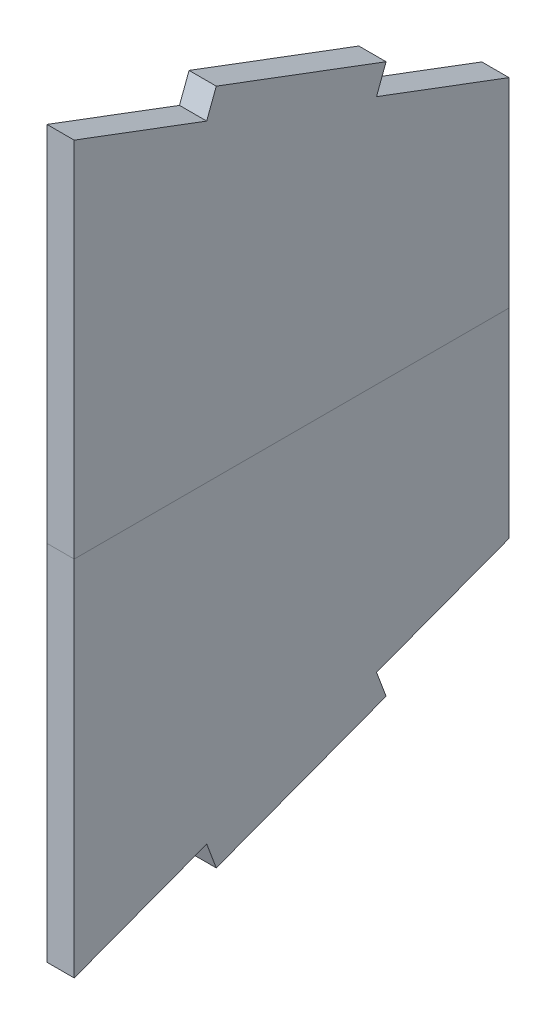
ISO-10303-21;
HEADER;
FILE_DESCRIPTION(('STEP AP214'),'2;1');
FILE_NAME('part.step','',(''),(''),'','','');
FILE_SCHEMA(('AUTOMOTIVE_DESIGN { 1 0 10303 214 1 1 1 1 }'));
ENDSEC;
DATA;
#1=APPLICATION_CONTEXT('core data for automotive mechanical design processes');
#2=APPLICATION_PROTOCOL_DEFINITION('international standard','automotive_design',2000,#1);
#3=PRODUCT_CONTEXT('',#1,'mechanical');
#4=PRODUCT('Part','Part','',(#3));
#5=PRODUCT_RELATED_PRODUCT_CATEGORY('part','',(#4));
#6=PRODUCT_DEFINITION_FORMATION('','',#4);
#7=PRODUCT_DEFINITION_CONTEXT('part definition',#1,'design');
#8=PRODUCT_DEFINITION('design','',#6,#7);
#9=PRODUCT_DEFINITION_SHAPE('','',#8);
#10=(LENGTH_UNIT() NAMED_UNIT(*) SI_UNIT(.MILLI.,.METRE.));
#11=(NAMED_UNIT(*) PLANE_ANGLE_UNIT() SI_UNIT($,.RADIAN.));
#12=(NAMED_UNIT(*) SI_UNIT($,.STERADIAN.) SOLID_ANGLE_UNIT());
#13=UNCERTAINTY_MEASURE_WITH_UNIT(LENGTH_MEASURE(1.E-05),#10,'distance_accuracy_value','');
#14=(GEOMETRIC_REPRESENTATION_CONTEXT(3) GLOBAL_UNCERTAINTY_ASSIGNED_CONTEXT((#13)) GLOBAL_UNIT_ASSIGNED_CONTEXT((#10,
#11,#12)) REPRESENTATION_CONTEXT('',''));
#15=CARTESIAN_POINT('',(0.,0.,0.));
#16=DIRECTION('',(0.,0.,1.));
#17=DIRECTION('',(1.,0.,0.));
#18=AXIS2_PLACEMENT_3D('',#15,#16,#17);
#19=CARTESIAN_POINT('',(-3.,0.,0.));
#20=DIRECTION('',(1.,0.,0.));
#21=DIRECTION('',(0.,-1.,0.));
#22=AXIS2_PLACEMENT_3D('',#19,#20,#21);
#23=PLANE('',#22);
#24=DIRECTION('',(0.,0.,-1.));
#25=VECTOR('',#24,1.);
#26=CARTESIAN_POINT('',(-3.,0.,47.9408425331089));
#27=LINE('',#26,#25);
#28=CARTESIAN_POINT('',(-3.,0.,47.9408425331089));
#29=VERTEX_POINT('',#28);
#30=CARTESIAN_POINT('',(-3.,0.,0.));
#31=VERTEX_POINT('',#30);
#32=EDGE_CURVE('E204',#29,#31,#27,.T.);
#33=ORIENTED_EDGE('',*,*,#32,.T.);
#34=DIRECTION('',(0.,-1.,0.));
#35=VECTOR('',#34,1.);
#36=CARTESIAN_POINT('',(-3.,0.,0.));
#37=LINE('',#36,#35);
#38=CARTESIAN_POINT('',(-3.,-22.,0.));
#39=VERTEX_POINT('',#38);
#40=EDGE_CURVE('E214',#31,#39,#37,.T.);
#41=ORIENTED_EDGE('',*,*,#40,.T.);
#42=DIRECTION('',(0.,-0.351503212513812,0.936186675611478));
#43=VECTOR('',#42,1.);
#44=CARTESIAN_POINT('',(-3.,-22.,0.));
#45=LINE('',#44,#43);
#46=CARTESIAN_POINT('',(-3.,-27.4849678748619,14.6085545104397));
#47=VERTEX_POINT('',#46);
#48=EDGE_CURVE('E224',#39,#47,#45,.T.);
#49=ORIENTED_EDGE('',*,*,#48,.T.);
#50=DIRECTION('',(0.,-0.936186675611477,-0.351503212513814));
#51=VECTOR('',#50,1.);
#52=CARTESIAN_POINT('',(-3.,-27.4849678748619,14.6085545104397));
#53=LINE('',#52,#51);
#54=CARTESIAN_POINT('',(-3.,-30.2935279016963,13.5540448728982));
#55=VERTEX_POINT('',#54);
#56=EDGE_CURVE('E234',#47,#55,#53,.T.);
#57=ORIENTED_EDGE('',*,*,#56,.T.);
#58=DIRECTION('',(0.,-0.351503212513812,0.936186675611477));
#59=VECTOR('',#58,1.);
#60=CARTESIAN_POINT('',(-3.,-30.2935279016963,13.5540448728982));
#61=LINE('',#60,#59);
#62=CARTESIAN_POINT('',(-3.,-37.3235921519726,32.2777783851278));
#63=VERTEX_POINT('',#62);
#64=EDGE_CURVE('E244',#55,#63,#61,.T.);
#65=ORIENTED_EDGE('',*,*,#64,.T.);
#66=DIRECTION('',(0.,0.936186675611477,0.351503212513813));
#67=VECTOR('',#66,1.);
#68=CARTESIAN_POINT('',(-3.,-37.3235921519726,32.2777783851278));
#69=LINE('',#68,#67);
#70=CARTESIAN_POINT('',(-3.,-34.5150321251381,33.3322880226692));
#71=VERTEX_POINT('',#70);
#72=EDGE_CURVE('E254',#63,#71,#69,.T.);
#73=ORIENTED_EDGE('',*,*,#72,.T.);
#74=DIRECTION('',(0.,-0.351503212513812,0.936186675611478));
#75=VECTOR('',#74,1.);
#76=CARTESIAN_POINT('',(-3.,-34.5150321251381,33.3322880226692));
#77=LINE('',#76,#75);
#78=CARTESIAN_POINT('',(-3.,-40.,47.9408425331089));
#79=VERTEX_POINT('',#78);
#80=EDGE_CURVE('E264',#71,#79,#77,.T.);
#81=ORIENTED_EDGE('',*,*,#80,.T.);
#82=DIRECTION('',(0.,1.,0.));
#83=VECTOR('',#82,1.);
#84=CARTESIAN_POINT('',(-3.,-40.,47.9408425331089));
#85=LINE('',#84,#83);
#86=EDGE_CURVE('E11',#79,#29,#85,.T.);
#87=ORIENTED_EDGE('',*,*,#86,.T.);
#88=EDGE_LOOP('',(#33,#41,#49,#57,#65,#73,#81,#87));
#89=FACE_BOUND('',#88,.T.);
#90=ADVANCED_FACE('F17',(#89),#23,.F.);
#91=CARTESIAN_POINT('',(0.,0.,0.));
#92=DIRECTION('',(1.,0.,0.));
#93=DIRECTION('',(0.,-1.,0.));
#94=AXIS2_PLACEMENT_3D('',#91,#92,#93);
#95=PLANE('',#94);
#96=DIRECTION('',(0.,0.,-1.));
#97=VECTOR('',#96,1.);
#98=CARTESIAN_POINT('',(0.,0.,47.9408425331089));
#99=LINE('',#98,#97);
#100=CARTESIAN_POINT('',(0.,0.,47.9408425331089));
#101=VERTEX_POINT('',#100);
#102=CARTESIAN_POINT('',(0.,0.,0.));
#103=VERTEX_POINT('',#102);
#104=EDGE_CURVE('E137',#101,#103,#99,.T.);
#105=ORIENTED_EDGE('',*,*,#104,.F.);
#106=DIRECTION('',(0.,1.,0.));
#107=VECTOR('',#106,1.);
#108=CARTESIAN_POINT('',(0.,-40.,47.9408425331089));
#109=LINE('',#108,#107);
#110=CARTESIAN_POINT('',(0.,-40.,47.9408425331089));
#111=VERTEX_POINT('',#110);
#112=EDGE_CURVE('E24',#111,#101,#109,.T.);
#113=ORIENTED_EDGE('',*,*,#112,.F.);
#114=DIRECTION('',(0.,-0.351503212513812,0.936186675611478));
#115=VECTOR('',#114,1.);
#116=CARTESIAN_POINT('',(0.,-34.5150321251381,33.3322880226692));
#117=LINE('',#116,#115);
#118=CARTESIAN_POINT('',(0.,-34.5150321251381,33.3322880226692));
#119=VERTEX_POINT('',#118);
#120=EDGE_CURVE('E260',#119,#111,#117,.T.);
#121=ORIENTED_EDGE('',*,*,#120,.F.);
#122=DIRECTION('',(0.,0.936186675611477,0.351503212513813));
#123=VECTOR('',#122,1.);
#124=CARTESIAN_POINT('',(0.,-37.3235921519726,32.2777783851278));
#125=LINE('',#124,#123);
#126=CARTESIAN_POINT('',(0.,-37.3235921519726,32.2777783851278));
#127=VERTEX_POINT('',#126);
#128=EDGE_CURVE('E250',#127,#119,#125,.T.);
#129=ORIENTED_EDGE('',*,*,#128,.F.);
#130=DIRECTION('',(0.,-0.351503212513812,0.936186675611477));
#131=VECTOR('',#130,1.);
#132=CARTESIAN_POINT('',(0.,-30.2935279016963,13.5540448728982));
#133=LINE('',#132,#131);
#134=CARTESIAN_POINT('',(0.,-30.2935279016963,13.5540448728982));
#135=VERTEX_POINT('',#134);
#136=EDGE_CURVE('E240',#135,#127,#133,.T.);
#137=ORIENTED_EDGE('',*,*,#136,.F.);
#138=DIRECTION('',(0.,-0.936186675611477,-0.351503212513814));
#139=VECTOR('',#138,1.);
#140=CARTESIAN_POINT('',(0.,-27.4849678748619,14.6085545104397));
#141=LINE('',#140,#139);
#142=CARTESIAN_POINT('',(0.,-27.4849678748619,14.6085545104397));
#143=VERTEX_POINT('',#142);
#144=EDGE_CURVE('E230',#143,#135,#141,.T.);
#145=ORIENTED_EDGE('',*,*,#144,.F.);
#146=DIRECTION('',(0.,-0.351503212513812,0.936186675611478));
#147=VECTOR('',#146,1.);
#148=CARTESIAN_POINT('',(0.,-22.,0.));
#149=LINE('',#148,#147);
#150=CARTESIAN_POINT('',(0.,-22.,0.));
#151=VERTEX_POINT('',#150);
#152=EDGE_CURVE('E220',#151,#143,#149,.T.);
#153=ORIENTED_EDGE('',*,*,#152,.F.);
#154=DIRECTION('',(0.,-1.,0.));
#155=VECTOR('',#154,1.);
#156=CARTESIAN_POINT('',(0.,0.,0.));
#157=LINE('',#156,#155);
#158=EDGE_CURVE('E210',#103,#151,#157,.T.);
#159=ORIENTED_EDGE('',*,*,#158,.F.);
#160=EDGE_LOOP('',(#105,#113,#121,#129,#137,#145,#153,#159));
#161=FACE_BOUND('',#160,.T.);
#162=ADVANCED_FACE('F276',(#161),#95,.T.);
#163=CARTESIAN_POINT('',(-3.,-40.,47.9408425331089));
#164=DIRECTION('',(0.,0.,1.));
#165=DIRECTION('',(1.,0.,0.));
#166=AXIS2_PLACEMENT_3D('',#163,#164,#165);
#167=PLANE('',#166);
#168=ORIENTED_EDGE('',*,*,#112,.T.);
#169=DIRECTION('',(1.,0.,0.));
#170=VECTOR('',#169,1.);
#171=CARTESIAN_POINT('',(-3.,0.,47.9408425331089));
#172=LINE('',#171,#170);
#173=EDGE_CURVE('E201',#29,#101,#172,.T.);
#174=ORIENTED_EDGE('',*,*,#173,.F.);
#175=ORIENTED_EDGE('',*,*,#86,.F.);
#176=DIRECTION('',(1.,0.,0.));
#177=VECTOR('',#176,1.);
#178=CARTESIAN_POINT('',(-3.,-40.,47.9408425331089));
#179=LINE('',#178,#177);
#180=EDGE_CURVE('E266',#79,#111,#179,.T.);
#181=ORIENTED_EDGE('',*,*,#180,.T.);
#182=EDGE_LOOP('',(#168,#174,#175,#181));
#183=FACE_BOUND('',#182,.T.);
#184=ADVANCED_FACE('F270',(#183),#167,.T.);
#185=CARTESIAN_POINT('',(-3.,-34.5150321251381,33.3322880226692));
#186=DIRECTION('',(0.,-0.936186675611478,-0.351503212513812));
#187=DIRECTION('',(0.,-0.351503212513812,0.936186675611478));
#188=AXIS2_PLACEMENT_3D('',#185,#186,#187);
#189=PLANE('',#188);
#190=ORIENTED_EDGE('',*,*,#120,.T.);
#191=ORIENTED_EDGE('',*,*,#180,.F.);
#192=ORIENTED_EDGE('',*,*,#80,.F.);
#193=DIRECTION('',(1.,0.,0.));
#194=VECTOR('',#193,1.);
#195=CARTESIAN_POINT('',(-3.,-34.5150321251381,33.3322880226692));
#196=LINE('',#195,#194);
#197=EDGE_CURVE('E257',#71,#119,#196,.T.);
#198=ORIENTED_EDGE('',*,*,#197,.T.);
#199=EDGE_LOOP('',(#190,#191,#192,#198));
#200=FACE_BOUND('',#199,.T.);
#201=ADVANCED_FACE('F283',(#200),#189,.T.);
#202=CARTESIAN_POINT('',(-3.,-37.3235921519726,32.2777783851278));
#203=DIRECTION('',(0.,-0.351503212513813,0.936186675611477));
#204=DIRECTION('',(0.,0.936186675611477,0.351503212513813));
#205=AXIS2_PLACEMENT_3D('',#202,#203,#204);
#206=PLANE('',#205);
#207=ORIENTED_EDGE('',*,*,#128,.T.);
#208=ORIENTED_EDGE('',*,*,#197,.F.);
#209=ORIENTED_EDGE('',*,*,#72,.F.);
#210=DIRECTION('',(1.,0.,0.));
#211=VECTOR('',#210,1.);
#212=CARTESIAN_POINT('',(-3.,-37.3235921519726,32.2777783851278));
#213=LINE('',#212,#211);
#214=EDGE_CURVE('E247',#63,#127,#213,.T.);
#215=ORIENTED_EDGE('',*,*,#214,.T.);
#216=EDGE_LOOP('',(#207,#208,#209,#215));
#217=FACE_BOUND('',#216,.T.);
#218=ADVANCED_FACE('F286',(#217),#206,.T.);
#219=CARTESIAN_POINT('',(-3.,-30.2935279016963,13.5540448728982));
#220=DIRECTION('',(0.,-0.936186675611477,-0.351503212513812));
#221=DIRECTION('',(0.,-0.351503212513812,0.936186675611478));
#222=AXIS2_PLACEMENT_3D('',#219,#220,#221);
#223=PLANE('',#222);
#224=ORIENTED_EDGE('',*,*,#136,.T.);
#225=ORIENTED_EDGE('',*,*,#214,.F.);
#226=ORIENTED_EDGE('',*,*,#64,.F.);
#227=DIRECTION('',(1.,0.,0.));
#228=VECTOR('',#227,1.);
#229=CARTESIAN_POINT('',(-3.,-30.2935279016963,13.5540448728982));
#230=LINE('',#229,#228);
#231=EDGE_CURVE('E237',#55,#135,#230,.T.);
#232=ORIENTED_EDGE('',*,*,#231,.T.);
#233=EDGE_LOOP('',(#224,#225,#226,#232));
#234=FACE_BOUND('',#233,.T.);
#235=ADVANCED_FACE('F288',(#234),#223,.T.);
#236=CARTESIAN_POINT('',(-3.,-27.4849678748619,14.6085545104397));
#237=DIRECTION('',(0.,0.351503212513814,-0.936186675611477));
#238=DIRECTION('',(0.,-0.936186675611477,-0.351503212513814));
#239=AXIS2_PLACEMENT_3D('',#236,#237,#238);
#240=PLANE('',#239);
#241=ORIENTED_EDGE('',*,*,#144,.T.);
#242=ORIENTED_EDGE('',*,*,#231,.F.);
#243=ORIENTED_EDGE('',*,*,#56,.F.);
#244=DIRECTION('',(1.,0.,0.));
#245=VECTOR('',#244,1.);
#246=CARTESIAN_POINT('',(-3.,-27.4849678748619,14.6085545104397));
#247=LINE('',#246,#245);
#248=EDGE_CURVE('E227',#47,#143,#247,.T.);
#249=ORIENTED_EDGE('',*,*,#248,.T.);
#250=EDGE_LOOP('',(#241,#242,#243,#249));
#251=FACE_BOUND('',#250,.T.);
#252=ADVANCED_FACE('F291',(#251),#240,.T.);
#253=CARTESIAN_POINT('',(-3.,-22.,0.));
#254=DIRECTION('',(0.,-0.936186675611478,-0.351503212513812));
#255=DIRECTION('',(0.,-0.351503212513812,0.936186675611478));
#256=AXIS2_PLACEMENT_3D('',#253,#254,#255);
#257=PLANE('',#256);
#258=ORIENTED_EDGE('',*,*,#152,.T.);
#259=ORIENTED_EDGE('',*,*,#248,.F.);
#260=ORIENTED_EDGE('',*,*,#48,.F.);
#261=DIRECTION('',(1.,0.,0.));
#262=VECTOR('',#261,1.);
#263=CARTESIAN_POINT('',(-3.,-22.,0.));
#264=LINE('',#263,#262);
#265=EDGE_CURVE('E217',#39,#151,#264,.T.);
#266=ORIENTED_EDGE('',*,*,#265,.T.);
#267=EDGE_LOOP('',(#258,#259,#260,#266));
#268=FACE_BOUND('',#267,.T.);
#269=ADVANCED_FACE('F294',(#268),#257,.T.);
#270=CARTESIAN_POINT('',(-3.,0.,0.));
#271=DIRECTION('',(0.,0.,-1.));
#272=DIRECTION('',(0.,-1.,0.));
#273=AXIS2_PLACEMENT_3D('',#270,#271,#272);
#274=PLANE('',#273);
#275=ORIENTED_EDGE('',*,*,#158,.T.);
#276=ORIENTED_EDGE('',*,*,#265,.F.);
#277=ORIENTED_EDGE('',*,*,#40,.F.);
#278=DIRECTION('',(1.,0.,0.));
#279=VECTOR('',#278,1.);
#280=CARTESIAN_POINT('',(-3.,0.,0.));
#281=LINE('',#280,#279);
#282=EDGE_CURVE('E207',#31,#103,#281,.T.);
#283=ORIENTED_EDGE('',*,*,#282,.T.);
#284=EDGE_LOOP('',(#275,#276,#277,#283));
#285=FACE_BOUND('',#284,.T.);
#286=ADVANCED_FACE('F279',(#285),#274,.T.);
#287=CARTESIAN_POINT('',(-3.,0.,47.9408425331089));
#288=DIRECTION('',(0.,1.,0.));
#289=DIRECTION('',(0.,0.,-1.));
#290=AXIS2_PLACEMENT_3D('',#287,#288,#289);
#291=PLANE('',#290);
#292=ORIENTED_EDGE('',*,*,#104,.T.);
#293=ORIENTED_EDGE('',*,*,#282,.F.);
#294=ORIENTED_EDGE('',*,*,#32,.F.);
#295=ORIENTED_EDGE('',*,*,#173,.T.);
#296=EDGE_LOOP('',(#292,#293,#294,#295));
#297=FACE_BOUND('',#296,.T.);
#298=ADVANCED_FACE('F274',(#297),#291,.T.);
#299=CLOSED_SHELL('',(#90,#162,#184,#201,#218,#235,#252,#269,#286,#298));
#300=MANIFOLD_SOLID_BREP('B1',#299);
#301=CARTESIAN_POINT('',(-3.,0.,47.9408425331089));
#302=DIRECTION('',(0.,-1.,0.));
#303=DIRECTION('',(0.,0.,-1.));
#304=AXIS2_PLACEMENT_3D('',#301,#302,#303);
#305=PLANE('',#304);
#306=DIRECTION('',(0.,0.,-1.));
#307=VECTOR('',#306,1.);
#308=CARTESIAN_POINT('',(0.,0.,47.9408425331089));
#309=LINE('',#308,#307);
#310=CARTESIAN_POINT('',(0.,0.,47.9408425331089));
#311=VERTEX_POINT('',#310);
#312=CARTESIAN_POINT('',(0.,0.,0.));
#313=VERTEX_POINT('',#312);
#314=EDGE_CURVE('E165',#311,#313,#309,.T.);
#315=ORIENTED_EDGE('',*,*,#314,.F.);
#316=DIRECTION('',(1.,0.,0.));
#317=VECTOR('',#316,1.);
#318=CARTESIAN_POINT('',(-3.,0.,47.9408425331089));
#319=LINE('',#318,#317);
#320=CARTESIAN_POINT('',(-3.,0.,47.9408425331089));
#321=VERTEX_POINT('',#320);
#322=EDGE_CURVE('E150',#321,#311,#319,.T.);
#323=ORIENTED_EDGE('',*,*,#322,.F.);
#324=DIRECTION('',(0.,0.,-1.));
#325=VECTOR('',#324,1.);
#326=CARTESIAN_POINT('',(-3.,0.,47.9408425331089));
#327=LINE('',#326,#325);
#328=CARTESIAN_POINT('',(-3.,0.,0.));
#329=VERTEX_POINT('',#328);
#330=EDGE_CURVE('E144',#321,#329,#327,.T.);
#331=ORIENTED_EDGE('',*,*,#330,.T.);
#332=DIRECTION('',(1.,0.,0.));
#333=VECTOR('',#332,1.);
#334=CARTESIAN_POINT('',(-3.,0.,0.));
#335=LINE('',#334,#333);
#336=EDGE_CURVE('E126',#329,#313,#335,.T.);
#337=ORIENTED_EDGE('',*,*,#336,.T.);
#338=EDGE_LOOP('',(#315,#323,#331,#337));
#339=FACE_BOUND('',#338,.T.);
#340=ADVANCED_FACE('F149',(#339),#305,.T.);
#341=CARTESIAN_POINT('',(-3.,0.,0.));
#342=DIRECTION('',(0.,0.,-1.));
#343=DIRECTION('',(0.,1.,0.));
#344=AXIS2_PLACEMENT_3D('',#341,#342,#343);
#345=PLANE('',#344);
#346=DIRECTION('',(0.,1.,0.));
#347=VECTOR('',#346,1.);
#348=CARTESIAN_POINT('',(0.,0.,0.));
#349=LINE('',#348,#347);
#350=CARTESIAN_POINT('',(0.,22.,0.));
#351=VERTEX_POINT('',#350);
#352=EDGE_CURVE('E132',#313,#351,#349,.T.);
#353=ORIENTED_EDGE('',*,*,#352,.F.);
#354=ORIENTED_EDGE('',*,*,#336,.F.);
#355=DIRECTION('',(0.,1.,0.));
#356=VECTOR('',#355,1.);
#357=CARTESIAN_POINT('',(-3.,0.,0.));
#358=LINE('',#357,#356);
#359=CARTESIAN_POINT('',(-3.,22.,0.));
#360=VERTEX_POINT('',#359);
#361=EDGE_CURVE('E129',#329,#360,#358,.T.);
#362=ORIENTED_EDGE('',*,*,#361,.T.);
#363=DIRECTION('',(1.,0.,0.));
#364=VECTOR('',#363,1.);
#365=CARTESIAN_POINT('',(-3.,22.,0.));
#366=LINE('',#365,#364);
#367=EDGE_CURVE('E138',#360,#351,#366,.T.);
#368=ORIENTED_EDGE('',*,*,#367,.T.);
#369=EDGE_LOOP('',(#353,#354,#362,#368));
#370=FACE_BOUND('',#369,.T.);
#371=ADVANCED_FACE('F128',(#370),#345,.T.);
#372=CARTESIAN_POINT('',(-3.,22.,0.));
#373=DIRECTION('',(0.,0.936186675611478,-0.351503212513812));
#374=DIRECTION('',(0.,0.351503212513812,0.936186675611478));
#375=AXIS2_PLACEMENT_3D('',#372,#373,#374);
#376=PLANE('',#375);
#377=DIRECTION('',(0.,0.351503212513812,0.936186675611478));
#378=VECTOR('',#377,1.);
#379=CARTESIAN_POINT('',(0.,22.,0.));
#380=LINE('',#379,#378);
#381=CARTESIAN_POINT('',(0.,27.4849678748619,14.6085545104397));
#382=VERTEX_POINT('',#381);
#383=EDGE_CURVE('E164',#351,#382,#380,.T.);
#384=ORIENTED_EDGE('',*,*,#383,.F.);
#385=ORIENTED_EDGE('',*,*,#367,.F.);
#386=DIRECTION('',(0.,0.351503212513812,0.936186675611478));
#387=VECTOR('',#386,1.);
#388=CARTESIAN_POINT('',(-3.,22.,0.));
#389=LINE('',#388,#387);
#390=CARTESIAN_POINT('',(-3.,27.4849678748619,14.6085545104397));
#391=VERTEX_POINT('',#390);
#392=EDGE_CURVE('E147',#360,#391,#389,.T.);
#393=ORIENTED_EDGE('',*,*,#392,.T.);
#394=DIRECTION('',(1.,0.,0.));
#395=VECTOR('',#394,1.);
#396=CARTESIAN_POINT('',(-3.,27.4849678748619,14.6085545104397));
#397=LINE('',#396,#395);
#398=EDGE_CURVE('E195',#391,#382,#397,.T.);
#399=ORIENTED_EDGE('',*,*,#398,.T.);
#400=EDGE_LOOP('',(#384,#385,#393,#399));
#401=FACE_BOUND('',#400,.T.);
#402=ADVANCED_FACE('F373',(#401),#376,.T.);
#403=CARTESIAN_POINT('',(-3.,27.4849678748619,14.6085545104397));
#404=DIRECTION('',(0.,-0.351503212513814,-0.936186675611477));
#405=DIRECTION('',(0.,0.936186675611477,-0.351503212513814));
#406=AXIS2_PLACEMENT_3D('',#403,#404,#405);
#407=PLANE('',#406);
#408=DIRECTION('',(0.,0.936186675611477,-0.351503212513814));
#409=VECTOR('',#408,1.);
#410=CARTESIAN_POINT('',(0.,27.4849678748619,14.6085545104397));
#411=LINE('',#410,#409);
#412=CARTESIAN_POINT('',(0.,30.2935279016963,13.5540448728982));
#413=VERTEX_POINT('',#412);
#414=EDGE_CURVE('E169',#382,#413,#411,.T.);
#415=ORIENTED_EDGE('',*,*,#414,.F.);
#416=ORIENTED_EDGE('',*,*,#398,.F.);
#417=DIRECTION('',(0.,0.936186675611477,-0.351503212513814));
#418=VECTOR('',#417,1.);
#419=CARTESIAN_POINT('',(-3.,27.4849678748619,14.6085545104397));
#420=LINE('',#419,#418);
#421=CARTESIAN_POINT('',(-3.,30.2935279016963,13.5540448728982));
#422=VERTEX_POINT('',#421);
#423=EDGE_CURVE('E617',#391,#422,#420,.T.);
#424=ORIENTED_EDGE('',*,*,#423,.T.);
#425=DIRECTION('',(1.,0.,0.));
#426=VECTOR('',#425,1.);
#427=CARTESIAN_POINT('',(-3.,30.2935279016963,13.5540448728982));
#428=LINE('',#427,#426);
#429=EDGE_CURVE('E193',#422,#413,#428,.T.);
#430=ORIENTED_EDGE('',*,*,#429,.T.);
#431=EDGE_LOOP('',(#415,#416,#424,#430));
#432=FACE_BOUND('',#431,.T.);
#433=ADVANCED_FACE('F383',(#432),#407,.T.);
#434=CARTESIAN_POINT('',(-3.,30.2935279016963,13.5540448728982));
#435=DIRECTION('',(0.,0.936186675611477,-0.351503212513812));
#436=DIRECTION('',(0.,0.351503212513812,0.936186675611478));
#437=AXIS2_PLACEMENT_3D('',#434,#435,#436);
#438=PLANE('',#437);
#439=DIRECTION('',(0.,0.351503212513812,0.936186675611477));
#440=VECTOR('',#439,1.);
#441=CARTESIAN_POINT('',(0.,30.2935279016963,13.5540448728982));
#442=LINE('',#441,#440);
#443=CARTESIAN_POINT('',(0.,37.3235921519726,32.2777783851278));
#444=VERTEX_POINT('',#443);
#445=EDGE_CURVE('E173',#413,#444,#442,.T.);
#446=ORIENTED_EDGE('',*,*,#445,.F.);
#447=ORIENTED_EDGE('',*,*,#429,.F.);
#448=DIRECTION('',(0.,0.351503212513812,0.936186675611477));
#449=VECTOR('',#448,1.);
#450=CARTESIAN_POINT('',(-3.,30.2935279016963,13.5540448728982));
#451=LINE('',#450,#449);
#452=CARTESIAN_POINT('',(-3.,37.3235921519726,32.2777783851278));
#453=VERTEX_POINT('',#452);
#454=EDGE_CURVE('E612',#422,#453,#451,.T.);
#455=ORIENTED_EDGE('',*,*,#454,.T.);
#456=DIRECTION('',(1.,0.,0.));
#457=VECTOR('',#456,1.);
#458=CARTESIAN_POINT('',(-3.,37.3235921519726,32.2777783851278));
#459=LINE('',#458,#457);
#460=EDGE_CURVE('E191',#453,#444,#459,.T.);
#461=ORIENTED_EDGE('',*,*,#460,.T.);
#462=EDGE_LOOP('',(#446,#447,#455,#461));
#463=FACE_BOUND('',#462,.T.);
#464=ADVANCED_FACE('F394',(#463),#438,.T.);
#465=CARTESIAN_POINT('',(-3.,37.3235921519726,32.2777783851278));
#466=DIRECTION('',(0.,0.351503212513813,0.936186675611477));
#467=DIRECTION('',(0.,-0.936186675611477,0.351503212513813));
#468=AXIS2_PLACEMENT_3D('',#465,#466,#467);
#469=PLANE('',#468);
#470=DIRECTION('',(0.,-0.936186675611477,0.351503212513813));
#471=VECTOR('',#470,1.);
#472=CARTESIAN_POINT('',(0.,37.3235921519726,32.2777783851278));
#473=LINE('',#472,#471);
#474=CARTESIAN_POINT('',(0.,34.5150321251381,33.3322880226692));
#475=VERTEX_POINT('',#474);
#476=EDGE_CURVE('E177',#444,#475,#473,.T.);
#477=ORIENTED_EDGE('',*,*,#476,.F.);
#478=ORIENTED_EDGE('',*,*,#460,.F.);
#479=DIRECTION('',(0.,-0.936186675611477,0.351503212513813));
#480=VECTOR('',#479,1.);
#481=CARTESIAN_POINT('',(-3.,37.3235921519726,32.2777783851278));
#482=LINE('',#481,#480);
#483=CARTESIAN_POINT('',(-3.,34.5150321251381,33.3322880226692));
#484=VERTEX_POINT('',#483);
#485=EDGE_CURVE('E610',#453,#484,#482,.T.);
#486=ORIENTED_EDGE('',*,*,#485,.T.);
#487=DIRECTION('',(1.,0.,0.));
#488=VECTOR('',#487,1.);
#489=CARTESIAN_POINT('',(-3.,34.5150321251381,33.3322880226692));
#490=LINE('',#489,#488);
#491=EDGE_CURVE('E189',#484,#475,#490,.T.);
#492=ORIENTED_EDGE('',*,*,#491,.T.);
#493=EDGE_LOOP('',(#477,#478,#486,#492));
#494=FACE_BOUND('',#493,.T.);
#495=ADVANCED_FACE('F405',(#494),#469,.T.);
#496=CARTESIAN_POINT('',(-3.,34.5150321251381,33.3322880226692));
#497=DIRECTION('',(0.,0.936186675611478,-0.351503212513812));
#498=DIRECTION('',(0.,0.351503212513812,0.936186675611478));
#499=AXIS2_PLACEMENT_3D('',#496,#497,#498);
#500=PLANE('',#499);
#501=DIRECTION('',(0.,0.351503212513812,0.936186675611478));
#502=VECTOR('',#501,1.);
#503=CARTESIAN_POINT('',(0.,34.5150321251381,33.3322880226692));
#504=LINE('',#503,#502);
#505=CARTESIAN_POINT('',(0.,40.,47.9408425331089));
#506=VERTEX_POINT('',#505);
#507=EDGE_CURVE('E156',#475,#506,#504,.T.);
#508=ORIENTED_EDGE('',*,*,#507,.F.);
#509=ORIENTED_EDGE('',*,*,#491,.F.);
#510=DIRECTION('',(0.,0.351503212513812,0.936186675611478));
#511=VECTOR('',#510,1.);
#512=CARTESIAN_POINT('',(-3.,34.5150321251381,33.3322880226692));
#513=LINE('',#512,#511);
#514=CARTESIAN_POINT('',(-3.,40.,47.9408425331089));
#515=VERTEX_POINT('',#514);
#516=EDGE_CURVE('E609',#484,#515,#513,.T.);
#517=ORIENTED_EDGE('',*,*,#516,.T.);
#518=DIRECTION('',(1.,0.,0.));
#519=VECTOR('',#518,1.);
#520=CARTESIAN_POINT('',(-3.,40.,47.9408425331089));
#521=LINE('',#520,#519);
#522=EDGE_CURVE('E187',#515,#506,#521,.T.);
#523=ORIENTED_EDGE('',*,*,#522,.T.);
#524=EDGE_LOOP('',(#508,#509,#517,#523));
#525=FACE_BOUND('',#524,.T.);
#526=ADVANCED_FACE('F416',(#525),#500,.T.);
#527=CARTESIAN_POINT('',(-3.,40.,47.9408425331089));
#528=DIRECTION('',(0.,0.,1.));
#529=DIRECTION('',(1.,0.,0.));
#530=AXIS2_PLACEMENT_3D('',#527,#528,#529);
#531=PLANE('',#530);
#532=DIRECTION('',(0.,-1.,0.));
#533=VECTOR('',#532,1.);
#534=CARTESIAN_POINT('',(0.,40.,47.9408425331089));
#535=LINE('',#534,#533);
#536=EDGE_CURVE('E152',#506,#311,#535,.T.);
#537=ORIENTED_EDGE('',*,*,#536,.F.);
#538=ORIENTED_EDGE('',*,*,#522,.F.);
#539=DIRECTION('',(0.,-1.,0.));
#540=VECTOR('',#539,1.);
#541=CARTESIAN_POINT('',(-3.,40.,47.9408425331089));
#542=LINE('',#541,#540);
#543=EDGE_CURVE('E160',#515,#321,#542,.T.);
#544=ORIENTED_EDGE('',*,*,#543,.T.);
#545=ORIENTED_EDGE('',*,*,#322,.T.);
#546=EDGE_LOOP('',(#537,#538,#544,#545));
#547=FACE_BOUND('',#546,.T.);
#548=ADVANCED_FACE('F427',(#547),#531,.T.);
#549=CARTESIAN_POINT('',(-3.,0.,0.));
#550=DIRECTION('',(1.,0.,0.));
#551=DIRECTION('',(0.,1.,0.));
#552=AXIS2_PLACEMENT_3D('',#549,#550,#551);
#553=PLANE('',#552);
#554=ORIENTED_EDGE('',*,*,#330,.F.);
#555=ORIENTED_EDGE('',*,*,#543,.F.);
#556=ORIENTED_EDGE('',*,*,#516,.F.);
#557=ORIENTED_EDGE('',*,*,#485,.F.);
#558=ORIENTED_EDGE('',*,*,#454,.F.);
#559=ORIENTED_EDGE('',*,*,#423,.F.);
#560=ORIENTED_EDGE('',*,*,#392,.F.);
#561=ORIENTED_EDGE('',*,*,#361,.F.);
#562=EDGE_LOOP('',(#554,#555,#556,#557,#558,#559,#560,#561));
#563=FACE_BOUND('',#562,.T.);
#564=ADVANCED_FACE('F142',(#563),#553,.F.);
#565=CARTESIAN_POINT('',(0.,0.,0.));
#566=DIRECTION('',(1.,0.,0.));
#567=DIRECTION('',(0.,1.,0.));
#568=AXIS2_PLACEMENT_3D('',#565,#566,#567);
#569=PLANE('',#568);
#570=ORIENTED_EDGE('',*,*,#314,.T.);
#571=ORIENTED_EDGE('',*,*,#352,.T.);
#572=ORIENTED_EDGE('',*,*,#383,.T.);
#573=ORIENTED_EDGE('',*,*,#414,.T.);
#574=ORIENTED_EDGE('',*,*,#445,.T.);
#575=ORIENTED_EDGE('',*,*,#476,.T.);
#576=ORIENTED_EDGE('',*,*,#507,.T.);
#577=ORIENTED_EDGE('',*,*,#536,.T.);
#578=EDGE_LOOP('',(#570,#571,#572,#573,#574,#575,#576,#577));
#579=FACE_BOUND('',#578,.T.);
#580=ADVANCED_FACE('F448',(#579),#569,.T.);
#581=CLOSED_SHELL('',(#340,#371,#402,#433,#464,#495,#526,#548,#564,#580));
#582=MANIFOLD_SOLID_BREP('B1',#581);
#583=ADVANCED_BREP_SHAPE_REPRESENTATION('',(#18,#300,#582),#14);
#584=SHAPE_DEFINITION_REPRESENTATION(#9,#583);
ENDSEC;
END-ISO-10303-21;
